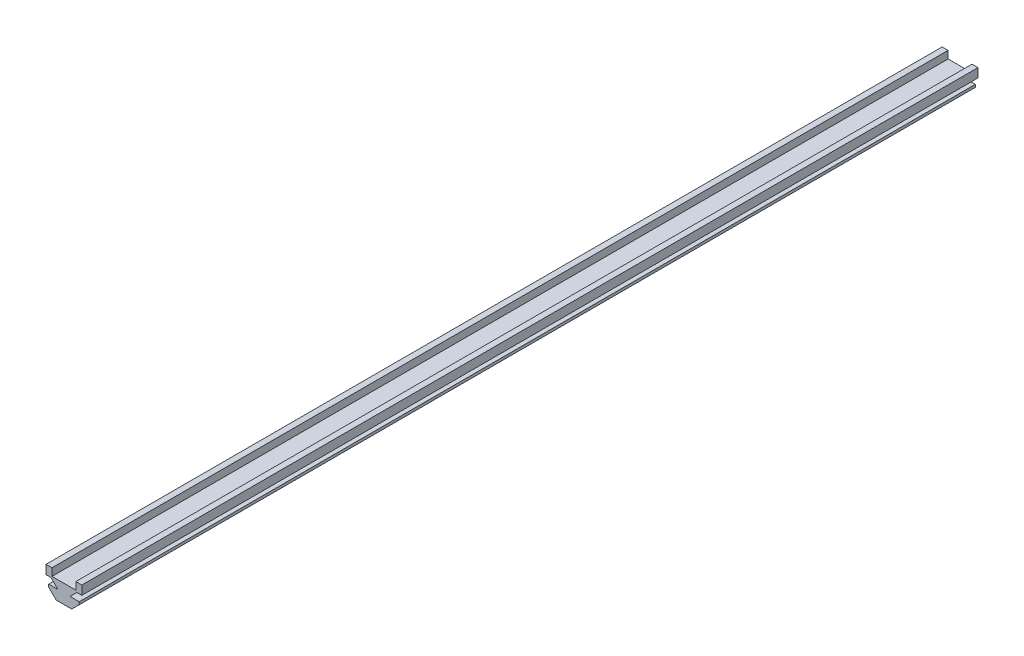
ISO-10303-21;
HEADER;
FILE_DESCRIPTION(('STEP AP214'),'2;1');
FILE_NAME('part.step','',(''),(''),'','','');
FILE_SCHEMA(('AUTOMOTIVE_DESIGN { 1 0 10303 214 1 1 1 1 }'));
ENDSEC;
DATA;
#1=APPLICATION_CONTEXT('core data for automotive mechanical design processes');
#2=APPLICATION_PROTOCOL_DEFINITION('international standard','automotive_design',2000,#1);
#3=PRODUCT_CONTEXT('',#1,'mechanical');
#4=PRODUCT('Part','Part','',(#3));
#5=PRODUCT_RELATED_PRODUCT_CATEGORY('part','',(#4));
#6=PRODUCT_DEFINITION_FORMATION('','',#4);
#7=PRODUCT_DEFINITION_CONTEXT('part definition',#1,'design');
#8=PRODUCT_DEFINITION('design','',#6,#7);
#9=PRODUCT_DEFINITION_SHAPE('','',#8);
#10=(LENGTH_UNIT() NAMED_UNIT(*) SI_UNIT(.MILLI.,.METRE.));
#11=(NAMED_UNIT(*) PLANE_ANGLE_UNIT() SI_UNIT($,.RADIAN.));
#12=(NAMED_UNIT(*) SI_UNIT($,.STERADIAN.) SOLID_ANGLE_UNIT());
#13=UNCERTAINTY_MEASURE_WITH_UNIT(LENGTH_MEASURE(1.E-05),#10,'distance_accuracy_value','');
#14=(GEOMETRIC_REPRESENTATION_CONTEXT(3) GLOBAL_UNCERTAINTY_ASSIGNED_CONTEXT((#13)) GLOBAL_UNIT_ASSIGNED_CONTEXT((#10,
#11,#12)) REPRESENTATION_CONTEXT('',''));
#15=CARTESIAN_POINT('',(0.,0.,0.));
#16=DIRECTION('',(0.,0.,1.));
#17=DIRECTION('',(1.,0.,0.));
#18=AXIS2_PLACEMENT_3D('',#15,#16,#17);
#19=CARTESIAN_POINT('',(4.00000000000002,0.,300.));
#20=DIRECTION('',(-1.,0.,0.));
#21=DIRECTION('',(0.,0.,1.));
#22=AXIS2_PLACEMENT_3D('',#19,#20,#21);
#23=PLANE('',#22);
#24=DIRECTION('',(0.,1.,0.));
#25=VECTOR('',#24,1.);
#26=CARTESIAN_POINT('',(4.00000000000002,0.,0.));
#27=LINE('',#26,#25);
#28=CARTESIAN_POINT('',(4.00000000000002,0.,0.));
#29=VERTEX_POINT('',#28);
#30=CARTESIAN_POINT('',(4.00000000000002,3.00000000000007,0.));
#31=VERTEX_POINT('',#30);
#32=EDGE_CURVE('E201',#29,#31,#27,.T.);
#33=ORIENTED_EDGE('',*,*,#32,.F.);
#34=DIRECTION('',(0.,0.,-1.));
#35=VECTOR('',#34,1.);
#36=CARTESIAN_POINT('',(4.00000000000002,0.,300.));
#37=LINE('',#36,#35);
#38=CARTESIAN_POINT('',(4.00000000000002,0.,300.));
#39=VERTEX_POINT('',#38);
#40=EDGE_CURVE('E11',#39,#29,#37,.T.);
#41=ORIENTED_EDGE('',*,*,#40,.F.);
#42=DIRECTION('',(0.,1.,0.));
#43=VECTOR('',#42,1.);
#44=CARTESIAN_POINT('',(4.00000000000002,0.,300.));
#45=LINE('',#44,#43);
#46=CARTESIAN_POINT('',(4.00000000000002,3.00000000000007,300.));
#47=VERTEX_POINT('',#46);
#48=EDGE_CURVE('E264',#39,#47,#45,.T.);
#49=ORIENTED_EDGE('',*,*,#48,.T.);
#50=DIRECTION('',(0.,0.,-1.));
#51=VECTOR('',#50,1.);
#52=CARTESIAN_POINT('',(4.00000000000002,3.00000000000007,300.));
#53=LINE('',#52,#51);
#54=EDGE_CURVE('E122',#47,#31,#53,.T.);
#55=ORIENTED_EDGE('',*,*,#54,.T.);
#56=EDGE_LOOP('',(#33,#41,#49,#55));
#57=FACE_BOUND('',#56,.T.);
#58=ADVANCED_FACE('F41',(#57),#23,.T.);
#59=CARTESIAN_POINT('',(0.,0.,300.));
#60=DIRECTION('',(0.,-1.,0.));
#61=DIRECTION('',(1.,0.,0.));
#62=AXIS2_PLACEMENT_3D('',#59,#60,#61);
#63=PLANE('',#62);
#64=DIRECTION('',(-1.,0.,0.));
#65=VECTOR('',#64,1.);
#66=CARTESIAN_POINT('',(0.,0.,0.));
#67=LINE('',#66,#65);
#68=CARTESIAN_POINT('',(5.65710678118656,0.,0.));
#69=VERTEX_POINT('',#68);
#70=EDGE_CURVE('E205',#69,#29,#67,.T.);
#71=ORIENTED_EDGE('',*,*,#70,.F.);
#72=DIRECTION('',(0.,0.,-1.));
#73=VECTOR('',#72,1.);
#74=CARTESIAN_POINT('',(5.65710678118656,0.,300.));
#75=LINE('',#74,#73);
#76=CARTESIAN_POINT('',(5.65710678118656,0.,300.));
#77=VERTEX_POINT('',#76);
#78=EDGE_CURVE('E50',#77,#69,#75,.T.);
#79=ORIENTED_EDGE('',*,*,#78,.F.);
#80=DIRECTION('',(-1.,0.,0.));
#81=VECTOR('',#80,1.);
#82=CARTESIAN_POINT('',(0.,0.,300.));
#83=LINE('',#82,#81);
#84=EDGE_CURVE('E332',#77,#39,#83,.T.);
#85=ORIENTED_EDGE('',*,*,#84,.T.);
#86=ORIENTED_EDGE('',*,*,#40,.T.);
#87=EDGE_LOOP('',(#71,#79,#85,#86));
#88=FACE_BOUND('',#87,.T.);
#89=ADVANCED_FACE('F321',(#88),#63,.T.);
#90=CARTESIAN_POINT('',(2.82855339059332,2.82855339059331,300.));
#91=DIRECTION('',(-0.707106781186548,-0.707106781186547,0.));
#92=DIRECTION('',(0.707106781186547,-0.707106781186548,0.));
#93=AXIS2_PLACEMENT_3D('',#90,#91,#92);
#94=PLANE('',#93);
#95=DIRECTION('',(-0.707106781186547,0.707106781186548,0.));
#96=VECTOR('',#95,1.);
#97=CARTESIAN_POINT('',(2.82855339059332,2.82855339059331,0.));
#98=LINE('',#97,#96);
#99=CARTESIAN_POINT('',(7.95710678118658,-2.29999999999996,0.));
#100=VERTEX_POINT('',#99);
#101=EDGE_CURVE('E209',#100,#69,#98,.T.);
#102=ORIENTED_EDGE('',*,*,#101,.F.);
#103=DIRECTION('',(0.,0.,-1.));
#104=VECTOR('',#103,1.);
#105=CARTESIAN_POINT('',(7.95710678118658,-2.29999999999996,300.));
#106=LINE('',#105,#104);
#107=CARTESIAN_POINT('',(7.95710678118658,-2.29999999999996,300.));
#108=VERTEX_POINT('',#107);
#109=EDGE_CURVE('E308',#108,#100,#106,.T.);
#110=ORIENTED_EDGE('',*,*,#109,.F.);
#111=DIRECTION('',(-0.707106781186547,0.707106781186548,0.));
#112=VECTOR('',#111,1.);
#113=CARTESIAN_POINT('',(2.82855339059332,2.82855339059331,300.));
#114=LINE('',#113,#112);
#115=EDGE_CURVE('E317',#108,#77,#114,.T.);
#116=ORIENTED_EDGE('',*,*,#115,.T.);
#117=ORIENTED_EDGE('',*,*,#78,.T.);
#118=EDGE_LOOP('',(#102,#110,#116,#117));
#119=FACE_BOUND('',#118,.T.);
#120=ADVANCED_FACE('F315',(#119),#94,.T.);
#121=CARTESIAN_POINT('',(0.,-2.29999999999996,300.));
#122=DIRECTION('',(0.,1.,0.));
#123=DIRECTION('',(0.,0.,1.));
#124=AXIS2_PLACEMENT_3D('',#121,#122,#123);
#125=PLANE('',#124);
#126=DIRECTION('',(1.,0.,0.));
#127=VECTOR('',#126,1.);
#128=CARTESIAN_POINT('',(0.,-2.29999999999996,0.));
#129=LINE('',#128,#127);
#130=CARTESIAN_POINT('',(4.90000000000005,-2.29999999999996,0.));
#131=VERTEX_POINT('',#130);
#132=EDGE_CURVE('E213',#131,#100,#129,.T.);
#133=ORIENTED_EDGE('',*,*,#132,.F.);
#134=DIRECTION('',(0.,0.,-1.));
#135=VECTOR('',#134,1.);
#136=CARTESIAN_POINT('',(4.90000000000005,-2.29999999999996,300.));
#137=LINE('',#136,#135);
#138=CARTESIAN_POINT('',(4.90000000000005,-2.29999999999996,300.));
#139=VERTEX_POINT('',#138);
#140=EDGE_CURVE('E305',#139,#131,#137,.T.);
#141=ORIENTED_EDGE('',*,*,#140,.F.);
#142=DIRECTION('',(1.,0.,0.));
#143=VECTOR('',#142,1.);
#144=CARTESIAN_POINT('',(0.,-2.29999999999996,300.));
#145=LINE('',#144,#143);
#146=EDGE_CURVE('E331',#139,#108,#145,.T.);
#147=ORIENTED_EDGE('',*,*,#146,.T.);
#148=ORIENTED_EDGE('',*,*,#109,.T.);
#149=EDGE_LOOP('',(#133,#141,#147,#148));
#150=FACE_BOUND('',#149,.T.);
#151=ADVANCED_FACE('F327',(#150),#125,.T.);
#152=CARTESIAN_POINT('',(4.90000000000005,0.,300.));
#153=DIRECTION('',(1.,0.,0.));
#154=DIRECTION('',(0.,0.,-1.));
#155=AXIS2_PLACEMENT_3D('',#152,#153,#154);
#156=PLANE('',#155);
#157=DIRECTION('',(0.,-1.,0.));
#158=VECTOR('',#157,1.);
#159=CARTESIAN_POINT('',(4.90000000000005,0.,0.));
#160=LINE('',#159,#158);
#161=CARTESIAN_POINT('',(4.90000000000005,-3.20294372515229,0.));
#162=VERTEX_POINT('',#161);
#163=EDGE_CURVE('E217',#131,#162,#160,.T.);
#164=ORIENTED_EDGE('',*,*,#163,.T.);
#165=DIRECTION('',(0.,0.,-1.));
#166=VECTOR('',#165,1.);
#167=CARTESIAN_POINT('',(4.90000000000005,-3.20294372515229,300.));
#168=LINE('',#167,#166);
#169=CARTESIAN_POINT('',(4.90000000000005,-3.20294372515229,300.));
#170=VERTEX_POINT('',#169);
#171=EDGE_CURVE('E302',#170,#162,#168,.T.);
#172=ORIENTED_EDGE('',*,*,#171,.F.);
#173=DIRECTION('',(0.,-1.,0.));
#174=VECTOR('',#173,1.);
#175=CARTESIAN_POINT('',(4.90000000000005,0.,300.));
#176=LINE('',#175,#174);
#177=EDGE_CURVE('E337',#139,#170,#176,.T.);
#178=ORIENTED_EDGE('',*,*,#177,.F.);
#179=ORIENTED_EDGE('',*,*,#140,.T.);
#180=EDGE_LOOP('',(#164,#172,#178,#179));
#181=FACE_BOUND('',#180,.T.);
#182=ADVANCED_FACE('F394',(#181),#156,.F.);
#183=CARTESIAN_POINT('',(0.848528137423882,0.848528137423882,300.));
#184=DIRECTION('',(-0.707106781186548,-0.707106781186548,0.));
#185=DIRECTION('',(0.707106781186548,-0.707106781186548,0.));
#186=AXIS2_PLACEMENT_3D('',#183,#184,#185);
#187=PLANE('',#186);
#188=DIRECTION('',(-0.707106781186548,0.707106781186548,0.));
#189=VECTOR('',#188,1.);
#190=CARTESIAN_POINT('',(0.848528137423882,0.848528137423882,0.));
#191=LINE('',#190,#189);
#192=CARTESIAN_POINT('',(7.37205627484774,-5.67499999999998,0.));
#193=VERTEX_POINT('',#192);
#194=EDGE_CURVE('E221',#193,#162,#191,.T.);
#195=ORIENTED_EDGE('',*,*,#194,.F.);
#196=DIRECTION('',(0.,0.,-1.));
#197=VECTOR('',#196,1.);
#198=CARTESIAN_POINT('',(7.37205627484774,-5.67499999999998,300.));
#199=LINE('',#198,#197);
#200=CARTESIAN_POINT('',(7.37205627484774,-5.67499999999998,300.));
#201=VERTEX_POINT('',#200);
#202=EDGE_CURVE('E299',#201,#193,#199,.T.);
#203=ORIENTED_EDGE('',*,*,#202,.F.);
#204=DIRECTION('',(-0.707106781186548,0.707106781186548,0.));
#205=VECTOR('',#204,1.);
#206=CARTESIAN_POINT('',(0.848528137423882,0.848528137423882,300.));
#207=LINE('',#206,#205);
#208=EDGE_CURVE('E344',#201,#170,#207,.T.);
#209=ORIENTED_EDGE('',*,*,#208,.T.);
#210=ORIENTED_EDGE('',*,*,#171,.T.);
#211=EDGE_LOOP('',(#195,#203,#209,#210));
#212=FACE_BOUND('',#211,.T.);
#213=ADVANCED_FACE('F397',(#212),#187,.T.);
#214=CARTESIAN_POINT('',(0.,-5.675,300.));
#215=DIRECTION('',(0.,1.,0.));
#216=DIRECTION('',(-1.,0.,0.));
#217=AXIS2_PLACEMENT_3D('',#214,#215,#216);
#218=PLANE('',#217);
#219=DIRECTION('',(1.,0.,0.));
#220=VECTOR('',#219,1.);
#221=CARTESIAN_POINT('',(0.,-5.675,0.));
#222=LINE('',#221,#220);
#223=CARTESIAN_POINT('',(12.6279437251523,-5.67499999999996,0.));
#224=VERTEX_POINT('',#223);
#225=EDGE_CURVE('E225',#193,#224,#222,.T.);
#226=ORIENTED_EDGE('',*,*,#225,.T.);
#227=DIRECTION('',(0.,0.,-1.));
#228=VECTOR('',#227,1.);
#229=CARTESIAN_POINT('',(12.6279437251523,-5.67499999999996,300.));
#230=LINE('',#229,#228);
#231=CARTESIAN_POINT('',(12.6279437251523,-5.67499999999996,300.));
#232=VERTEX_POINT('',#231);
#233=EDGE_CURVE('E295',#232,#224,#230,.T.);
#234=ORIENTED_EDGE('',*,*,#233,.F.);
#235=DIRECTION('',(1.,0.,0.));
#236=VECTOR('',#235,1.);
#237=CARTESIAN_POINT('',(0.,-5.675,300.));
#238=LINE('',#237,#236);
#239=EDGE_CURVE('E348',#201,#232,#238,.T.);
#240=ORIENTED_EDGE('',*,*,#239,.F.);
#241=ORIENTED_EDGE('',*,*,#202,.T.);
#242=EDGE_LOOP('',(#226,#234,#240,#241));
#243=FACE_BOUND('',#242,.T.);
#244=ADVANCED_FACE('F401',(#243),#218,.F.);
#245=CARTESIAN_POINT('',(9.15147186257619,-9.15147186257612,300.));
#246=DIRECTION('',(-0.70710678118655,0.707106781186544,0.));
#247=DIRECTION('',(-0.707106781186545,-0.707106781186551,0.));
#248=AXIS2_PLACEMENT_3D('',#245,#246,#247);
#249=PLANE('',#248);
#250=DIRECTION('',(0.707106781186545,0.707106781186551,0.));
#251=VECTOR('',#250,1.);
#252=CARTESIAN_POINT('',(9.15147186257619,-9.15147186257612,0.));
#253=LINE('',#252,#251);
#254=CARTESIAN_POINT('',(15.1,-3.20294372515226,0.));
#255=VERTEX_POINT('',#254);
#256=EDGE_CURVE('E228',#224,#255,#253,.T.);
#257=ORIENTED_EDGE('',*,*,#256,.T.);
#258=DIRECTION('',(0.,0.,-1.));
#259=VECTOR('',#258,1.);
#260=CARTESIAN_POINT('',(15.1,-3.20294372515226,300.));
#261=LINE('',#260,#259);
#262=CARTESIAN_POINT('',(15.1,-3.20294372515226,300.));
#263=VERTEX_POINT('',#262);
#264=EDGE_CURVE('E292',#263,#255,#261,.T.);
#265=ORIENTED_EDGE('',*,*,#264,.F.);
#266=DIRECTION('',(0.707106781186545,0.707106781186551,0.));
#267=VECTOR('',#266,1.);
#268=CARTESIAN_POINT('',(9.15147186257619,-9.15147186257612,300.));
#269=LINE('',#268,#267);
#270=EDGE_CURVE('E351',#232,#263,#269,.T.);
#271=ORIENTED_EDGE('',*,*,#270,.F.);
#272=ORIENTED_EDGE('',*,*,#233,.T.);
#273=EDGE_LOOP('',(#257,#265,#271,#272));
#274=FACE_BOUND('',#273,.T.);
#275=ADVANCED_FACE('F405',(#274),#249,.F.);
#276=CARTESIAN_POINT('',(15.1,0.,300.));
#277=DIRECTION('',(1.,0.,0.));
#278=DIRECTION('',(0.,1.,0.));
#279=AXIS2_PLACEMENT_3D('',#276,#277,#278);
#280=PLANE('',#279);
#281=DIRECTION('',(0.,-1.,0.));
#282=VECTOR('',#281,1.);
#283=CARTESIAN_POINT('',(15.1,0.,0.));
#284=LINE('',#283,#282);
#285=CARTESIAN_POINT('',(15.1,-2.29999999999993,0.));
#286=VERTEX_POINT('',#285);
#287=EDGE_CURVE('E232',#286,#255,#284,.T.);
#288=ORIENTED_EDGE('',*,*,#287,.F.);
#289=DIRECTION('',(0.,0.,-1.));
#290=VECTOR('',#289,1.);
#291=CARTESIAN_POINT('',(15.1,-2.29999999999993,300.));
#292=LINE('',#291,#290);
#293=CARTESIAN_POINT('',(15.1,-2.29999999999993,300.));
#294=VERTEX_POINT('',#293);
#295=EDGE_CURVE('E289',#294,#286,#292,.T.);
#296=ORIENTED_EDGE('',*,*,#295,.F.);
#297=DIRECTION('',(0.,-1.,0.));
#298=VECTOR('',#297,1.);
#299=CARTESIAN_POINT('',(15.1,0.,300.));
#300=LINE('',#299,#298);
#301=EDGE_CURVE('E354',#294,#263,#300,.T.);
#302=ORIENTED_EDGE('',*,*,#301,.T.);
#303=ORIENTED_EDGE('',*,*,#264,.T.);
#304=EDGE_LOOP('',(#288,#296,#302,#303));
#305=FACE_BOUND('',#304,.T.);
#306=ADVANCED_FACE('F409',(#305),#280,.T.);
#307=CARTESIAN_POINT('',(0.,-2.3,300.));
#308=DIRECTION('',(0.,-1.,0.));
#309=DIRECTION('',(1.,0.,0.));
#310=AXIS2_PLACEMENT_3D('',#307,#308,#309);
#311=PLANE('',#310);
#312=DIRECTION('',(-1.,0.,0.));
#313=VECTOR('',#312,1.);
#314=CARTESIAN_POINT('',(0.,-2.3,0.));
#315=LINE('',#314,#313);
#316=CARTESIAN_POINT('',(12.0428932188135,-2.29999999999995,0.));
#317=VERTEX_POINT('',#316);
#318=EDGE_CURVE('E236',#286,#317,#315,.T.);
#319=ORIENTED_EDGE('',*,*,#318,.T.);
#320=DIRECTION('',(0.,0.,-1.));
#321=VECTOR('',#320,1.);
#322=CARTESIAN_POINT('',(12.0428932188135,-2.29999999999995,300.));
#323=LINE('',#322,#321);
#324=CARTESIAN_POINT('',(12.0428932188135,-2.29999999999995,300.));
#325=VERTEX_POINT('',#324);
#326=EDGE_CURVE('E285',#325,#317,#323,.T.);
#327=ORIENTED_EDGE('',*,*,#326,.F.);
#328=DIRECTION('',(-1.,0.,0.));
#329=VECTOR('',#328,1.);
#330=CARTESIAN_POINT('',(0.,-2.3,300.));
#331=LINE('',#330,#329);
#332=EDGE_CURVE('E358',#294,#325,#331,.T.);
#333=ORIENTED_EDGE('',*,*,#332,.F.);
#334=ORIENTED_EDGE('',*,*,#295,.T.);
#335=EDGE_LOOP('',(#319,#327,#333,#334));
#336=FACE_BOUND('',#335,.T.);
#337=ADVANCED_FACE('F413',(#336),#311,.F.);
#338=CARTESIAN_POINT('',(7.17144660940677,-7.1714466094067,300.));
#339=DIRECTION('',(-0.707106781186551,0.707106781186544,0.));
#340=DIRECTION('',(-0.707106781186544,-0.707106781186551,0.));
#341=AXIS2_PLACEMENT_3D('',#338,#339,#340);
#342=PLANE('',#341);
#343=DIRECTION('',(0.707106781186544,0.707106781186551,0.));
#344=VECTOR('',#343,1.);
#345=CARTESIAN_POINT('',(7.17144660940677,-7.1714466094067,0.));
#346=LINE('',#345,#344);
#347=CARTESIAN_POINT('',(14.3428932188135,0.,0.));
#348=VERTEX_POINT('',#347);
#349=EDGE_CURVE('E239',#317,#348,#346,.T.);
#350=ORIENTED_EDGE('',*,*,#349,.T.);
#351=DIRECTION('',(0.,0.,-1.));
#352=VECTOR('',#351,1.);
#353=CARTESIAN_POINT('',(14.3428932188135,0.,300.));
#354=LINE('',#353,#352);
#355=CARTESIAN_POINT('',(14.3428932188135,0.,300.));
#356=VERTEX_POINT('',#355);
#357=EDGE_CURVE('E281',#356,#348,#354,.T.);
#358=ORIENTED_EDGE('',*,*,#357,.F.);
#359=DIRECTION('',(0.707106781186544,0.707106781186551,0.));
#360=VECTOR('',#359,1.);
#361=CARTESIAN_POINT('',(7.17144660940677,-7.1714466094067,300.));
#362=LINE('',#361,#360);
#363=EDGE_CURVE('E361',#325,#356,#362,.T.);
#364=ORIENTED_EDGE('',*,*,#363,.F.);
#365=ORIENTED_EDGE('',*,*,#326,.T.);
#366=EDGE_LOOP('',(#350,#358,#364,#365));
#367=FACE_BOUND('',#366,.T.);
#368=ADVANCED_FACE('F417',(#367),#342,.F.);
#369=CARTESIAN_POINT('',(0.,0.,300.));
#370=DIRECTION('',(0.,1.,0.));
#371=DIRECTION('',(-1.,0.,0.));
#372=AXIS2_PLACEMENT_3D('',#369,#370,#371);
#373=PLANE('',#372);
#374=DIRECTION('',(1.,0.,0.));
#375=VECTOR('',#374,1.);
#376=CARTESIAN_POINT('',(0.,0.,0.));
#377=LINE('',#376,#375);
#378=CARTESIAN_POINT('',(16.,0.,0.));
#379=VERTEX_POINT('',#378);
#380=EDGE_CURVE('E242',#348,#379,#377,.T.);
#381=ORIENTED_EDGE('',*,*,#380,.T.);
#382=DIRECTION('',(0.,0.,-1.));
#383=VECTOR('',#382,1.);
#384=CARTESIAN_POINT('',(16.,0.,300.));
#385=LINE('',#384,#383);
#386=CARTESIAN_POINT('',(16.,0.,300.));
#387=VERTEX_POINT('',#386);
#388=EDGE_CURVE('E277',#387,#379,#385,.T.);
#389=ORIENTED_EDGE('',*,*,#388,.F.);
#390=DIRECTION('',(1.,0.,0.));
#391=VECTOR('',#390,1.);
#392=CARTESIAN_POINT('',(0.,0.,300.));
#393=LINE('',#392,#391);
#394=EDGE_CURVE('E364',#356,#387,#393,.T.);
#395=ORIENTED_EDGE('',*,*,#394,.F.);
#396=ORIENTED_EDGE('',*,*,#357,.T.);
#397=EDGE_LOOP('',(#381,#389,#395,#396));
#398=FACE_BOUND('',#397,.T.);
#399=ADVANCED_FACE('F421',(#398),#373,.F.);
#400=CARTESIAN_POINT('',(16.,0.,300.));
#401=DIRECTION('',(-1.,0.,0.));
#402=DIRECTION('',(0.,-1.,0.));
#403=AXIS2_PLACEMENT_3D('',#400,#401,#402);
#404=PLANE('',#403);
#405=DIRECTION('',(0.,1.,0.));
#406=VECTOR('',#405,1.);
#407=CARTESIAN_POINT('',(16.,0.,0.));
#408=LINE('',#407,#406);
#409=CARTESIAN_POINT('',(16.,3.0000000000001,0.));
#410=VERTEX_POINT('',#409);
#411=EDGE_CURVE('E245',#379,#410,#408,.T.);
#412=ORIENTED_EDGE('',*,*,#411,.T.);
#413=DIRECTION('',(0.,0.,-1.));
#414=VECTOR('',#413,1.);
#415=CARTESIAN_POINT('',(16.,3.0000000000001,300.));
#416=LINE('',#415,#414);
#417=CARTESIAN_POINT('',(16.,3.0000000000001,300.));
#418=VERTEX_POINT('',#417);
#419=EDGE_CURVE('E274',#418,#410,#416,.T.);
#420=ORIENTED_EDGE('',*,*,#419,.F.);
#421=DIRECTION('',(0.,1.,0.));
#422=VECTOR('',#421,1.);
#423=CARTESIAN_POINT('',(16.,0.,300.));
#424=LINE('',#423,#422);
#425=EDGE_CURVE('E367',#387,#418,#424,.T.);
#426=ORIENTED_EDGE('',*,*,#425,.F.);
#427=ORIENTED_EDGE('',*,*,#388,.T.);
#428=EDGE_LOOP('',(#412,#420,#426,#427));
#429=FACE_BOUND('',#428,.T.);
#430=ADVANCED_FACE('F425',(#429),#404,.F.);
#431=CARTESIAN_POINT('',(0.,3.00000000000003,300.));
#432=DIRECTION('',(0.,1.,0.));
#433=DIRECTION('',(-1.,0.,0.));
#434=AXIS2_PLACEMENT_3D('',#431,#432,#433);
#435=PLANE('',#434);
#436=DIRECTION('',(1.,0.,0.));
#437=VECTOR('',#436,1.);
#438=CARTESIAN_POINT('',(0.,3.00000000000003,0.));
#439=LINE('',#438,#437);
#440=CARTESIAN_POINT('',(14.,3.00000000000009,0.));
#441=VERTEX_POINT('',#440);
#442=EDGE_CURVE('E249',#441,#410,#439,.T.);
#443=ORIENTED_EDGE('',*,*,#442,.F.);
#444=DIRECTION('',(0.,0.,-1.));
#445=VECTOR('',#444,1.);
#446=CARTESIAN_POINT('',(14.,3.00000000000009,300.));
#447=LINE('',#446,#445);
#448=CARTESIAN_POINT('',(14.,3.00000000000009,300.));
#449=VERTEX_POINT('',#448);
#450=EDGE_CURVE('E271',#449,#441,#447,.T.);
#451=ORIENTED_EDGE('',*,*,#450,.F.);
#452=DIRECTION('',(1.,0.,0.));
#453=VECTOR('',#452,1.);
#454=CARTESIAN_POINT('',(0.,3.00000000000003,300.));
#455=LINE('',#454,#453);
#456=EDGE_CURVE('E195',#449,#418,#455,.T.);
#457=ORIENTED_EDGE('',*,*,#456,.T.);
#458=ORIENTED_EDGE('',*,*,#419,.T.);
#459=EDGE_LOOP('',(#443,#451,#457,#458));
#460=FACE_BOUND('',#459,.T.);
#461=ADVANCED_FACE('F373',(#460),#435,.T.);
#462=CARTESIAN_POINT('',(14.,0.,300.));
#463=DIRECTION('',(-1.,0.,0.));
#464=DIRECTION('',(0.,-1.,0.));
#465=AXIS2_PLACEMENT_3D('',#462,#463,#464);
#466=PLANE('',#465);
#467=DIRECTION('',(0.,1.,0.));
#468=VECTOR('',#467,1.);
#469=CARTESIAN_POINT('',(14.,0.,0.));
#470=LINE('',#469,#468);
#471=CARTESIAN_POINT('',(14.,0.50000000000006,0.));
#472=VERTEX_POINT('',#471);
#473=EDGE_CURVE('E253',#472,#441,#470,.T.);
#474=ORIENTED_EDGE('',*,*,#473,.F.);
#475=DIRECTION('',(0.,0.,-1.));
#476=VECTOR('',#475,1.);
#477=CARTESIAN_POINT('',(14.,0.50000000000006,300.));
#478=LINE('',#477,#476);
#479=CARTESIAN_POINT('',(14.,0.50000000000006,300.));
#480=VERTEX_POINT('',#479);
#481=EDGE_CURVE('E180',#480,#472,#478,.T.);
#482=ORIENTED_EDGE('',*,*,#481,.F.);
#483=DIRECTION('',(0.,1.,0.));
#484=VECTOR('',#483,1.);
#485=CARTESIAN_POINT('',(14.,0.,300.));
#486=LINE('',#485,#484);
#487=EDGE_CURVE('E191',#480,#449,#486,.T.);
#488=ORIENTED_EDGE('',*,*,#487,.T.);
#489=ORIENTED_EDGE('',*,*,#450,.T.);
#490=EDGE_LOOP('',(#474,#482,#488,#489));
#491=FACE_BOUND('',#490,.T.);
#492=ADVANCED_FACE('F378',(#491),#466,.T.);
#493=CARTESIAN_POINT('',(0.,0.500000000000027,300.));
#494=DIRECTION('',(0.,1.,0.));
#495=DIRECTION('',(-1.,0.,0.));
#496=AXIS2_PLACEMENT_3D('',#493,#494,#495);
#497=PLANE('',#496);
#498=DIRECTION('',(1.,0.,0.));
#499=VECTOR('',#498,1.);
#500=CARTESIAN_POINT('',(0.,0.500000000000027,0.));
#501=LINE('',#500,#499);
#502=CARTESIAN_POINT('',(6.00000000000003,0.500000000000041,0.));
#503=VERTEX_POINT('',#502);
#504=EDGE_CURVE('E178',#503,#472,#501,.T.);
#505=ORIENTED_EDGE('',*,*,#504,.F.);
#506=DIRECTION('',(0.,0.,-1.));
#507=VECTOR('',#506,1.);
#508=CARTESIAN_POINT('',(6.00000000000003,0.500000000000041,300.));
#509=LINE('',#508,#507);
#510=CARTESIAN_POINT('',(6.00000000000003,0.500000000000041,300.));
#511=VERTEX_POINT('',#510);
#512=EDGE_CURVE('E172',#511,#503,#509,.T.);
#513=ORIENTED_EDGE('',*,*,#512,.F.);
#514=DIRECTION('',(1.,0.,0.));
#515=VECTOR('',#514,1.);
#516=CARTESIAN_POINT('',(0.,0.500000000000027,300.));
#517=LINE('',#516,#515);
#518=EDGE_CURVE('E176',#511,#480,#517,.T.);
#519=ORIENTED_EDGE('',*,*,#518,.T.);
#520=ORIENTED_EDGE('',*,*,#481,.T.);
#521=EDGE_LOOP('',(#505,#513,#519,#520));
#522=FACE_BOUND('',#521,.T.);
#523=ADVANCED_FACE('F174',(#522),#497,.T.);
#524=CARTESIAN_POINT('',(6.00000000000004,0.,300.));
#525=DIRECTION('',(-1.,0.,0.));
#526=DIRECTION('',(0.,-1.,0.));
#527=AXIS2_PLACEMENT_3D('',#524,#525,#526);
#528=PLANE('',#527);
#529=DIRECTION('',(0.,1.,0.));
#530=VECTOR('',#529,1.);
#531=CARTESIAN_POINT('',(6.00000000000004,0.,0.));
#532=LINE('',#531,#530);
#533=CARTESIAN_POINT('',(6.00000000000002,3.00000000000007,0.));
#534=VERTEX_POINT('',#533);
#535=EDGE_CURVE('E115',#503,#534,#532,.T.);
#536=ORIENTED_EDGE('',*,*,#535,.T.);
#537=DIRECTION('',(0.,0.,-1.));
#538=VECTOR('',#537,1.);
#539=CARTESIAN_POINT('',(6.00000000000002,3.00000000000007,300.));
#540=LINE('',#539,#538);
#541=CARTESIAN_POINT('',(6.00000000000002,3.00000000000007,300.));
#542=VERTEX_POINT('',#541);
#543=EDGE_CURVE('E181',#542,#534,#540,.T.);
#544=ORIENTED_EDGE('',*,*,#543,.F.);
#545=DIRECTION('',(0.,1.,0.));
#546=VECTOR('',#545,1.);
#547=CARTESIAN_POINT('',(6.00000000000004,0.,300.));
#548=LINE('',#547,#546);
#549=EDGE_CURVE('E183',#511,#542,#548,.T.);
#550=ORIENTED_EDGE('',*,*,#549,.F.);
#551=ORIENTED_EDGE('',*,*,#512,.T.);
#552=EDGE_LOOP('',(#536,#544,#550,#551));
#553=FACE_BOUND('',#552,.T.);
#554=ADVANCED_FACE('F184',(#553),#528,.F.);
#555=CARTESIAN_POINT('',(0.,3.00000000000007,300.));
#556=DIRECTION('',(0.,-1.,0.));
#557=DIRECTION('',(1.,0.,0.));
#558=AXIS2_PLACEMENT_3D('',#555,#556,#557);
#559=PLANE('',#558);
#560=DIRECTION('',(-1.,0.,0.));
#561=VECTOR('',#560,1.);
#562=CARTESIAN_POINT('',(0.,3.00000000000007,0.));
#563=LINE('',#562,#561);
#564=EDGE_CURVE('E261',#534,#31,#563,.T.);
#565=ORIENTED_EDGE('',*,*,#564,.T.);
#566=ORIENTED_EDGE('',*,*,#54,.F.);
#567=DIRECTION('',(-1.,0.,0.));
#568=VECTOR('',#567,1.);
#569=CARTESIAN_POINT('',(0.,3.00000000000007,300.));
#570=LINE('',#569,#568);
#571=EDGE_CURVE('E58',#542,#47,#570,.T.);
#572=ORIENTED_EDGE('',*,*,#571,.F.);
#573=ORIENTED_EDGE('',*,*,#543,.T.);
#574=EDGE_LOOP('',(#565,#566,#572,#573));
#575=FACE_BOUND('',#574,.T.);
#576=ADVANCED_FACE('F381',(#575),#559,.F.);
#577=CARTESIAN_POINT('',(0.,0.,300.));
#578=DIRECTION('',(0.,0.,1.));
#579=DIRECTION('',(1.,0.,0.));
#580=AXIS2_PLACEMENT_3D('',#577,#578,#579);
#581=PLANE('',#580);
#582=ORIENTED_EDGE('',*,*,#48,.F.);
#583=ORIENTED_EDGE('',*,*,#84,.F.);
#584=ORIENTED_EDGE('',*,*,#115,.F.);
#585=ORIENTED_EDGE('',*,*,#146,.F.);
#586=ORIENTED_EDGE('',*,*,#177,.T.);
#587=ORIENTED_EDGE('',*,*,#208,.F.);
#588=ORIENTED_EDGE('',*,*,#239,.T.);
#589=ORIENTED_EDGE('',*,*,#270,.T.);
#590=ORIENTED_EDGE('',*,*,#301,.F.);
#591=ORIENTED_EDGE('',*,*,#332,.T.);
#592=ORIENTED_EDGE('',*,*,#363,.T.);
#593=ORIENTED_EDGE('',*,*,#394,.T.);
#594=ORIENTED_EDGE('',*,*,#425,.T.);
#595=ORIENTED_EDGE('',*,*,#456,.F.);
#596=ORIENTED_EDGE('',*,*,#487,.F.);
#597=ORIENTED_EDGE('',*,*,#518,.F.);
#598=ORIENTED_EDGE('',*,*,#549,.T.);
#599=ORIENTED_EDGE('',*,*,#571,.T.);
#600=EDGE_LOOP('',(#582,#583,#584,#585,#586,#587,#588,#589,#590,#591,#592,#593,#594,#595,#596,
#597,#598,#599));
#601=FACE_BOUND('',#600,.T.);
#602=ADVANCED_FACE('F188',(#601),#581,.T.);
#603=CARTESIAN_POINT('',(0.,0.,0.));
#604=DIRECTION('',(0.,0.,1.));
#605=DIRECTION('',(1.,0.,0.));
#606=AXIS2_PLACEMENT_3D('',#603,#604,#605);
#607=PLANE('',#606);
#608=ORIENTED_EDGE('',*,*,#32,.T.);
#609=ORIENTED_EDGE('',*,*,#564,.F.);
#610=ORIENTED_EDGE('',*,*,#535,.F.);
#611=ORIENTED_EDGE('',*,*,#504,.T.);
#612=ORIENTED_EDGE('',*,*,#473,.T.);
#613=ORIENTED_EDGE('',*,*,#442,.T.);
#614=ORIENTED_EDGE('',*,*,#411,.F.);
#615=ORIENTED_EDGE('',*,*,#380,.F.);
#616=ORIENTED_EDGE('',*,*,#349,.F.);
#617=ORIENTED_EDGE('',*,*,#318,.F.);
#618=ORIENTED_EDGE('',*,*,#287,.T.);
#619=ORIENTED_EDGE('',*,*,#256,.F.);
#620=ORIENTED_EDGE('',*,*,#225,.F.);
#621=ORIENTED_EDGE('',*,*,#194,.T.);
#622=ORIENTED_EDGE('',*,*,#163,.F.);
#623=ORIENTED_EDGE('',*,*,#132,.T.);
#624=ORIENTED_EDGE('',*,*,#101,.T.);
#625=ORIENTED_EDGE('',*,*,#70,.T.);
#626=EDGE_LOOP('',(#608,#609,#610,#611,#612,#613,#614,#615,#616,#617,#618,#619,#620,#621,#622,
#623,#624,#625));
#627=FACE_BOUND('',#626,.T.);
#628=ADVANCED_FACE('F323',(#627),#607,.F.);
#629=CLOSED_SHELL('',(#58,#89,#120,#151,#182,#213,#244,#275,#306,#337,#368,#399,#430,#461,#492,
#523,#554,#576,#602,#628));
#630=MANIFOLD_SOLID_BREP('B2',#629);
#631=ADVANCED_BREP_SHAPE_REPRESENTATION('',(#18,#630),#14);
#632=SHAPE_DEFINITION_REPRESENTATION(#9,#631);
ENDSEC;
END-ISO-10303-21;
